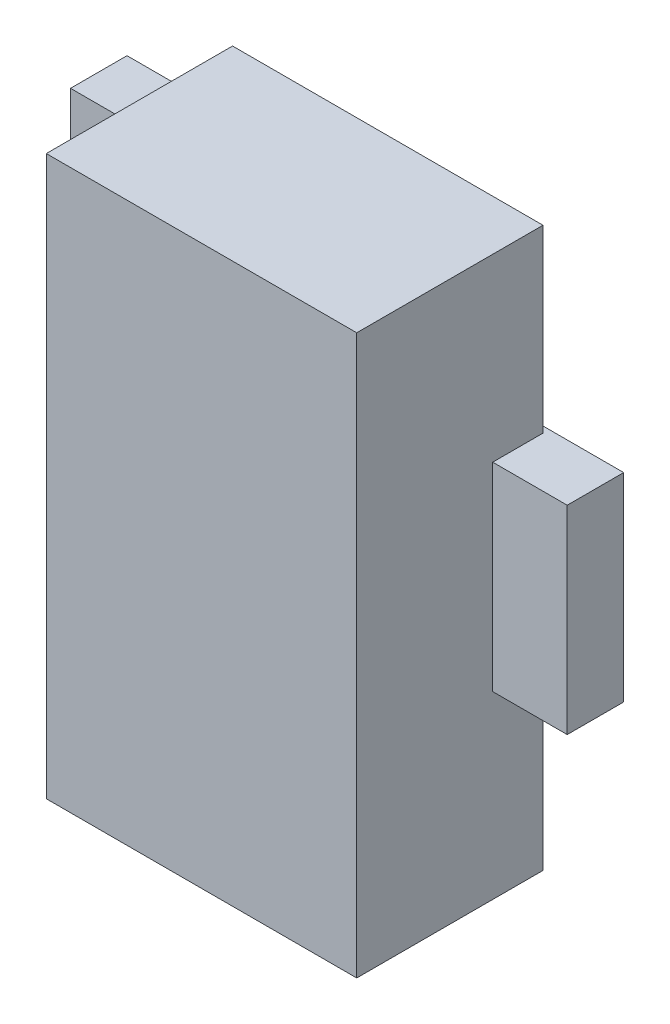
ISO-10303-21;
HEADER;
FILE_DESCRIPTION(('STEP AP214'),'2;1');
FILE_NAME('part.step','',(''),(''),'','','');
FILE_SCHEMA(('AUTOMOTIVE_DESIGN { 1 0 10303 214 1 1 1 1 }'));
ENDSEC;
DATA;
#1=APPLICATION_CONTEXT('core data for automotive mechanical design processes');
#2=APPLICATION_PROTOCOL_DEFINITION('international standard','automotive_design',2000,#1);
#3=PRODUCT_CONTEXT('',#1,'mechanical');
#4=PRODUCT('Part','Part','',(#3));
#5=PRODUCT_RELATED_PRODUCT_CATEGORY('part','',(#4));
#6=PRODUCT_DEFINITION_FORMATION('','',#4);
#7=PRODUCT_DEFINITION_CONTEXT('part definition',#1,'design');
#8=PRODUCT_DEFINITION('design','',#6,#7);
#9=PRODUCT_DEFINITION_SHAPE('','',#8);
#10=(LENGTH_UNIT() NAMED_UNIT(*) SI_UNIT(.MILLI.,.METRE.));
#11=(NAMED_UNIT(*) PLANE_ANGLE_UNIT() SI_UNIT($,.RADIAN.));
#12=(NAMED_UNIT(*) SI_UNIT($,.STERADIAN.) SOLID_ANGLE_UNIT());
#13=UNCERTAINTY_MEASURE_WITH_UNIT(LENGTH_MEASURE(1.E-05),#10,'distance_accuracy_value','');
#14=(GEOMETRIC_REPRESENTATION_CONTEXT(3) GLOBAL_UNCERTAINTY_ASSIGNED_CONTEXT((#13)) GLOBAL_UNIT_ASSIGNED_CONTEXT((#10,
#11,#12)) REPRESENTATION_CONTEXT('',''));
#15=CARTESIAN_POINT('',(0.,0.,0.));
#16=DIRECTION('',(0.,0.,1.));
#17=DIRECTION('',(1.,0.,0.));
#18=AXIS2_PLACEMENT_3D('',#15,#16,#17);
#19=CARTESIAN_POINT('',(-1.2250825886868,-1.70745613098144,0.405));
#20=DIRECTION('',(1.19248806385031E-08,-1.,0.));
#21=DIRECTION('',(0.,0.,1.));
#22=AXIS2_PLACEMENT_3D('',#19,#20,#21);
#23=PLANE('',#22);
#24=DIRECTION('',(0.,0.,-1.));
#25=VECTOR('',#24,1.);
#26=CARTESIAN_POINT('',(-1.2250825886868,-1.70745613098144,0.405));
#27=LINE('',#26,#25);
#28=CARTESIAN_POINT('',(-1.2250825886868,-1.70745613098144,0.405));
#29=VERTEX_POINT('',#28);
#30=CARTESIAN_POINT('',(-1.2250825886868,-1.70745613098144,-0.05));
#31=VERTEX_POINT('',#30);
#32=EDGE_CURVE('P0_E10',#29,#31,#27,.T.);
#33=ORIENTED_EDGE('',*,*,#32,.F.);
#34=DIRECTION('',(-1.,-1.19248806385031E-08,0.));
#35=VECTOR('',#34,1.);
#36=CARTESIAN_POINT('',(-1.2250825886868,-1.70745613098144,0.405));
#37=LINE('',#36,#35);
#38=CARTESIAN_POINT('',(-2.1250825886868,-1.70745614171384,0.405));
#39=VERTEX_POINT('',#38);
#40=EDGE_CURVE('P0_E23',#29,#39,#37,.T.);
#41=ORIENTED_EDGE('',*,*,#40,.T.);
#42=DIRECTION('',(0.,0.,1.));
#43=VECTOR('',#42,1.);
#44=CARTESIAN_POINT('',(-2.1250825886868,-1.70745614171384,0.405));
#45=LINE('',#44,#43);
#46=CARTESIAN_POINT('',(-2.1250825886868,-1.70745614171384,-0.05));
#47=VERTEX_POINT('',#46);
#48=EDGE_CURVE('P0_E59',#47,#39,#45,.T.);
#49=ORIENTED_EDGE('',*,*,#48,.F.);
#50=DIRECTION('',(-1.,-1.19248806385031E-08,0.));
#51=VECTOR('',#50,1.);
#52=CARTESIAN_POINT('',(-1.2250825886868,-1.70745613098144,-0.05));
#53=LINE('',#52,#51);
#54=EDGE_CURVE('P0_E85',#31,#47,#53,.T.);
#55=ORIENTED_EDGE('',*,*,#54,.F.);
#56=EDGE_LOOP('',(#33,#41,#49,#55));
#57=FACE_BOUND('',#56,.T.);
#58=ADVANCED_FACE('P0_F16',(#57),#23,.T.);
#59=CARTESIAN_POINT('',(-1.22508259363563,-1.29245613098144,0.405));
#60=DIRECTION('',(1.,1.19248806385031E-08,0.));
#61=DIRECTION('',(0.,0.,1.));
#62=AXIS2_PLACEMENT_3D('',#59,#60,#61);
#63=PLANE('',#62);
#64=DIRECTION('',(0.,0.,-1.));
#65=VECTOR('',#64,1.);
#66=CARTESIAN_POINT('',(-1.22508259363563,-1.29245613098144,0.405));
#67=LINE('',#66,#65);
#68=CARTESIAN_POINT('',(-1.22508259363563,-1.29245613098144,0.405));
#69=VERTEX_POINT('',#68);
#70=CARTESIAN_POINT('',(-1.22508259363563,-1.29245613098144,-0.05));
#71=VERTEX_POINT('',#70);
#72=EDGE_CURVE('P0_E83',#69,#71,#67,.T.);
#73=ORIENTED_EDGE('',*,*,#72,.F.);
#74=DIRECTION('',(1.19248806385031E-08,-1.,0.));
#75=VECTOR('',#74,1.);
#76=CARTESIAN_POINT('',(-1.22508259363563,-1.29245613098144,0.405));
#77=LINE('',#76,#75);
#78=EDGE_CURVE('P0_E74',#69,#29,#77,.T.);
#79=ORIENTED_EDGE('',*,*,#78,.T.);
#80=ORIENTED_EDGE('',*,*,#32,.T.);
#81=DIRECTION('',(1.19248806385031E-08,-1.,0.));
#82=VECTOR('',#81,1.);
#83=CARTESIAN_POINT('',(-1.22508259363563,-1.29245613098144,-0.05));
#84=LINE('',#83,#82);
#85=EDGE_CURVE('P0_E79',#71,#31,#84,.T.);
#86=ORIENTED_EDGE('',*,*,#85,.F.);
#87=EDGE_LOOP('',(#73,#79,#80,#86));
#88=FACE_BOUND('',#87,.T.);
#89=ADVANCED_FACE('P0_F88',(#88),#63,.T.);
#90=CARTESIAN_POINT('',(-1.22508259363563,-1.29245613098144,-0.05));
#91=DIRECTION('',(0.,0.,-1.));
#92=DIRECTION('',(1.19248806385031E-08,-1.,0.));
#93=AXIS2_PLACEMENT_3D('',#90,#91,#92);
#94=PLANE('',#93);
#95=DIRECTION('',(-1.,-1.19248806385031E-08,0.));
#96=VECTOR('',#95,1.);
#97=CARTESIAN_POINT('',(-2.12508259363563,-1.29245614171384,-0.05));
#98=LINE('',#97,#96);
#99=CARTESIAN_POINT('',(-2.12508259363563,-1.29245614171384,-0.05));
#100=VERTEX_POINT('',#99);
#101=EDGE_CURVE('P0_E69',#71,#100,#98,.T.);
#102=ORIENTED_EDGE('',*,*,#101,.F.);
#103=ORIENTED_EDGE('',*,*,#85,.T.);
#104=ORIENTED_EDGE('',*,*,#54,.T.);
#105=DIRECTION('',(1.19248806385031E-08,-1.,0.));
#106=VECTOR('',#105,1.);
#107=CARTESIAN_POINT('',(-2.1250825886868,-1.70745614171384,-0.05));
#108=LINE('',#107,#106);
#109=EDGE_CURVE('P0_E62',#100,#47,#108,.T.);
#110=ORIENTED_EDGE('',*,*,#109,.F.);
#111=EDGE_LOOP('',(#102,#103,#104,#110));
#112=FACE_BOUND('',#111,.T.);
#113=ADVANCED_FACE('P0_F90',(#112),#94,.T.);
#114=CARTESIAN_POINT('',(-2.1250825886868,-1.70745614171384,0.405));
#115=DIRECTION('',(-1.,-1.19248806385031E-08,0.));
#116=DIRECTION('',(0.,0.,-1.));
#117=AXIS2_PLACEMENT_3D('',#114,#115,#116);
#118=PLANE('',#117);
#119=ORIENTED_EDGE('',*,*,#48,.T.);
#120=DIRECTION('',(-1.19248806385031E-08,1.,0.));
#121=VECTOR('',#120,1.);
#122=CARTESIAN_POINT('',(-2.12508259363563,-1.29245614171384,0.405));
#123=LINE('',#122,#121);
#124=CARTESIAN_POINT('',(-2.12508259363563,-1.29245614171384,0.405));
#125=VERTEX_POINT('',#124);
#126=EDGE_CURVE('P0_E54',#39,#125,#123,.T.);
#127=ORIENTED_EDGE('',*,*,#126,.T.);
#128=DIRECTION('',(0.,0.,1.));
#129=VECTOR('',#128,1.);
#130=CARTESIAN_POINT('',(-2.12508259363563,-1.29245614171384,0.405));
#131=LINE('',#130,#129);
#132=EDGE_CURVE('P0_E58',#100,#125,#131,.T.);
#133=ORIENTED_EDGE('',*,*,#132,.F.);
#134=ORIENTED_EDGE('',*,*,#109,.T.);
#135=EDGE_LOOP('',(#119,#127,#133,#134));
#136=FACE_BOUND('',#135,.T.);
#137=ADVANCED_FACE('P0_F56',(#136),#118,.T.);
#138=CARTESIAN_POINT('',(-1.22508259363563,-1.29245613098144,0.405));
#139=DIRECTION('',(0.,0.,-1.));
#140=DIRECTION('',(1.19248806385031E-08,-1.,0.));
#141=AXIS2_PLACEMENT_3D('',#138,#139,#140);
#142=PLANE('',#141);
#143=ORIENTED_EDGE('',*,*,#126,.F.);
#144=ORIENTED_EDGE('',*,*,#40,.F.);
#145=ORIENTED_EDGE('',*,*,#78,.F.);
#146=DIRECTION('',(1.,1.19248806385031E-08,0.));
#147=VECTOR('',#146,1.);
#148=CARTESIAN_POINT('',(-2.12508259363563,-1.29245614171384,0.405));
#149=LINE('',#148,#147);
#150=EDGE_CURVE('P0_E67',#125,#69,#149,.T.);
#151=ORIENTED_EDGE('',*,*,#150,.F.);
#152=EDGE_LOOP('',(#143,#144,#145,#151));
#153=FACE_BOUND('',#152,.T.);
#154=ADVANCED_FACE('P0_F73',(#153),#142,.F.);
#155=CARTESIAN_POINT('',(-2.12508259363563,-1.29245614171384,0.405));
#156=DIRECTION('',(-1.19248806385031E-08,1.,0.));
#157=DIRECTION('',(0.,0.,-1.));
#158=AXIS2_PLACEMENT_3D('',#155,#156,#157);
#159=PLANE('',#158);
#160=ORIENTED_EDGE('',*,*,#132,.T.);
#161=ORIENTED_EDGE('',*,*,#150,.T.);
#162=ORIENTED_EDGE('',*,*,#72,.T.);
#163=ORIENTED_EDGE('',*,*,#101,.T.);
#164=EDGE_LOOP('',(#160,#161,#162,#163));
#165=FACE_BOUND('',#164,.T.);
#166=ADVANCED_FACE('P0_F66',(#165),#159,.T.);
#167=CLOSED_SHELL('',(#58,#89,#113,#137,#154,#166));
#168=MANIFOLD_SOLID_BREP('P0_B1',#167);
#169=CARTESIAN_POINT('',(-0.192582599508631,-0.799956118669006,0.));
#170=DIRECTION('',(1.19248806385031E-08,-1.,0.));
#171=DIRECTION('',(0.,0.,-1.));
#172=AXIS2_PLACEMENT_3D('',#169,#170,#171);
#173=PLANE('',#172);
#174=DIRECTION('',(1.,1.19248806385031E-08,0.));
#175=VECTOR('',#174,1.);
#176=CARTESIAN_POINT('',(-1.22508259950863,-0.799956130981445,0.405));
#177=LINE('',#176,#175);
#178=CARTESIAN_POINT('',(-0.192582599508631,-0.799956118669006,0.405));
#179=VERTEX_POINT('',#178);
#180=CARTESIAN_POINT('',(1.27491740049137,-0.799956101169244,0.405));
#181=VERTEX_POINT('',#180);
#182=EDGE_CURVE('P1_E11',#179,#181,#177,.T.);
#183=ORIENTED_EDGE('',*,*,#182,.T.);
#184=DIRECTION('',(0.,0.,1.));
#185=VECTOR('',#184,1.);
#186=CARTESIAN_POINT('',(1.27491740049137,-0.799956101169244,0.));
#187=LINE('',#186,#185);
#188=CARTESIAN_POINT('',(1.27491740049137,-0.799956101169244,0.));
#189=VERTEX_POINT('',#188);
#190=EDGE_CURVE('P1_E24',#189,#181,#187,.T.);
#191=ORIENTED_EDGE('',*,*,#190,.F.);
#192=DIRECTION('',(-1.,-1.19248806385031E-08,0.));
#193=VECTOR('',#192,1.);
#194=CARTESIAN_POINT('',(-1.22508259950863,-0.799956130981445,0.));
#195=LINE('',#194,#193);
#196=CARTESIAN_POINT('',(-0.192582599508631,-0.799956118669006,0.));
#197=VERTEX_POINT('',#196);
#198=EDGE_CURVE('P1_E202',#189,#197,#195,.T.);
#199=ORIENTED_EDGE('',*,*,#198,.T.);
#200=DIRECTION('',(0.,0.,1.));
#201=VECTOR('',#200,1.);
#202=CARTESIAN_POINT('',(-0.192582599508631,-0.799956118669006,0.));
#203=LINE('',#202,#201);
#204=EDGE_CURVE('P1_E200',#197,#179,#203,.T.);
#205=ORIENTED_EDGE('',*,*,#204,.T.);
#206=EDGE_LOOP('',(#183,#191,#199,#205));
#207=FACE_BOUND('',#206,.T.);
#208=ADVANCED_FACE('P1_F17',(#207),#173,.F.);
#209=CARTESIAN_POINT('',(-0.760082606276,-0.232456125436376,0.));
#210=DIRECTION('',(-0.707106772754384,-0.707106789618712,0.));
#211=DIRECTION('',(0.707106789618712,-0.707106772754384,0.));
#212=AXIS2_PLACEMENT_3D('',#209,#210,#211);
#213=PLANE('',#212);
#214=DIRECTION('',(0.707106789618711,-0.707106772754383,0.));
#215=VECTOR('',#214,1.);
#216=CARTESIAN_POINT('',(-0.760082606276,-0.232456125436376,0.405));
#217=LINE('',#216,#215);
#218=CARTESIAN_POINT('',(-0.760082606276,-0.232456125436376,0.405));
#219=VERTEX_POINT('',#218);
#220=EDGE_CURVE('P1_E198',#219,#179,#217,.T.);
#221=ORIENTED_EDGE('',*,*,#220,.T.);
#222=ORIENTED_EDGE('',*,*,#204,.F.);
#223=DIRECTION('',(-0.707106789618711,0.707106772754383,0.));
#224=VECTOR('',#223,1.);
#225=CARTESIAN_POINT('',(-0.192582599508631,-0.799956118669006,0.));
#226=LINE('',#225,#224);
#227=CARTESIAN_POINT('',(-0.760082606276,-0.232456125436376,0.));
#228=VERTEX_POINT('',#227);
#229=EDGE_CURVE('P1_E195',#197,#228,#226,.T.);
#230=ORIENTED_EDGE('',*,*,#229,.T.);
#231=DIRECTION('',(0.,0.,1.));
#232=VECTOR('',#231,1.);
#233=CARTESIAN_POINT('',(-0.760082606276,-0.232456125436376,0.));
#234=LINE('',#233,#232);
#235=EDGE_CURVE('P1_E192',#228,#219,#234,.T.);
#236=ORIENTED_EDGE('',*,*,#235,.T.);
#237=EDGE_LOOP('',(#221,#222,#230,#236));
#238=FACE_BOUND('',#237,.T.);
#239=ADVANCED_FACE('P1_F243',(#238),#213,.F.);
#240=CARTESIAN_POINT('',(1.27491738141156,0.800043898830756,0.));
#241=DIRECTION('',(-1.19248806385031E-08,1.,0.));
#242=DIRECTION('',(0.,0.,1.));
#243=AXIS2_PLACEMENT_3D('',#240,#241,#242);
#244=PLANE('',#243);
#245=DIRECTION('',(-1.,-1.19248806385031E-08,0.));
#246=VECTOR('',#245,1.);
#247=CARTESIAN_POINT('',(-1.22508261858844,0.800043869018555,0.405));
#248=LINE('',#247,#246);
#249=CARTESIAN_POINT('',(1.27491738141156,0.800043898830756,0.405));
#250=VERTEX_POINT('',#249);
#251=CARTESIAN_POINT('',(-0.19258261858844,0.800043881330994,0.405));
#252=VERTEX_POINT('',#251);
#253=EDGE_CURVE('P1_E189',#250,#252,#248,.T.);
#254=ORIENTED_EDGE('',*,*,#253,.T.);
#255=DIRECTION('',(0.,0.,-1.));
#256=VECTOR('',#255,1.);
#257=CARTESIAN_POINT('',(-0.19258261858844,0.800043881330994,0.));
#258=LINE('',#257,#256);
#259=CARTESIAN_POINT('',(-0.19258261858844,0.800043881330994,0.));
#260=VERTEX_POINT('',#259);
#261=EDGE_CURVE('P1_E186',#252,#260,#258,.T.);
#262=ORIENTED_EDGE('',*,*,#261,.T.);
#263=DIRECTION('',(1.,1.19248806385031E-08,0.));
#264=VECTOR('',#263,1.);
#265=CARTESIAN_POINT('',(-1.22508261858844,0.800043869018555,0.));
#266=LINE('',#265,#264);
#267=CARTESIAN_POINT('',(1.27491738141156,0.800043898830756,0.));
#268=VERTEX_POINT('',#267);
#269=EDGE_CURVE('P1_E184',#260,#268,#266,.T.);
#270=ORIENTED_EDGE('',*,*,#269,.T.);
#271=DIRECTION('',(0.,0.,-1.));
#272=VECTOR('',#271,1.);
#273=CARTESIAN_POINT('',(1.27491738141156,0.800043898830756,0.));
#274=LINE('',#273,#272);
#275=EDGE_CURVE('P1_E181',#250,#268,#274,.T.);
#276=ORIENTED_EDGE('',*,*,#275,.F.);
#277=EDGE_LOOP('',(#254,#262,#270,#276));
#278=FACE_BOUND('',#277,.T.);
#279=ADVANCED_FACE('P1_F210',(#278),#244,.F.);
#280=CARTESIAN_POINT('',(-0.19258261858844,0.800043881330994,0.));
#281=DIRECTION('',(-0.707106789618712,0.707106772754384,0.));
#282=DIRECTION('',(-0.707106772754384,-0.707106789618712,0.));
#283=AXIS2_PLACEMENT_3D('',#280,#281,#282);
#284=PLANE('',#283);
#285=DIRECTION('',(-0.707106772754383,-0.707106789618712,0.));
#286=VECTOR('',#285,1.);
#287=CARTESIAN_POINT('',(-0.19258261858844,0.800043881330994,0.405));
#288=LINE('',#287,#286);
#289=CARTESIAN_POINT('',(-0.76008261182107,0.232543874563624,0.405));
#290=VERTEX_POINT('',#289);
#291=EDGE_CURVE('P1_E179',#252,#290,#288,.T.);
#292=ORIENTED_EDGE('',*,*,#291,.T.);
#293=DIRECTION('',(0.,0.,-1.));
#294=VECTOR('',#293,1.);
#295=CARTESIAN_POINT('',(-0.76008261182107,0.232543874563624,0.));
#296=LINE('',#295,#294);
#297=CARTESIAN_POINT('',(-0.76008261182107,0.232543874563624,0.));
#298=VERTEX_POINT('',#297);
#299=EDGE_CURVE('P1_E177',#290,#298,#296,.T.);
#300=ORIENTED_EDGE('',*,*,#299,.T.);
#301=DIRECTION('',(0.707106772754383,0.707106789618712,0.));
#302=VECTOR('',#301,1.);
#303=CARTESIAN_POINT('',(-0.76008261182107,0.232543874563624,0.));
#304=LINE('',#303,#302);
#305=EDGE_CURVE('P1_E174',#298,#260,#304,.T.);
#306=ORIENTED_EDGE('',*,*,#305,.T.);
#307=ORIENTED_EDGE('',*,*,#261,.F.);
#308=EDGE_LOOP('',(#292,#300,#306,#307));
#309=FACE_BOUND('',#308,.T.);
#310=ADVANCED_FACE('P1_F212',(#309),#284,.F.);
#311=CARTESIAN_POINT('',(-1.22508263587952,2.25004386901856,0.405));
#312=DIRECTION('',(0.,0.,1.));
#313=DIRECTION('',(1.19248806385031E-08,-1.,0.));
#314=AXIS2_PLACEMENT_3D('',#311,#312,#313);
#315=PLANE('',#314);
#316=ORIENTED_EDGE('',*,*,#291,.F.);
#317=ORIENTED_EDGE('',*,*,#253,.F.);
#318=DIRECTION('',(-1.19248806385031E-08,1.,0.));
#319=VECTOR('',#318,1.);
#320=CARTESIAN_POINT('',(1.27491741778245,-2.24995610116924,0.405));
#321=LINE('',#320,#319);
#322=EDGE_CURVE('P1_E171',#181,#250,#321,.T.);
#323=ORIENTED_EDGE('',*,*,#322,.F.);
#324=ORIENTED_EDGE('',*,*,#182,.F.);
#325=ORIENTED_EDGE('',*,*,#220,.F.);
#326=DIRECTION('',(-1.,-1.19248806385031E-08,0.));
#327=VECTOR('',#326,1.);
#328=CARTESIAN_POINT('',(-1.225082606276,-0.232456130981445,0.405));
#329=LINE('',#328,#327);
#330=CARTESIAN_POINT('',(-1.225082606276,-0.232456130981445,0.405));
#331=VERTEX_POINT('',#330);
#332=EDGE_CURVE('P1_E168',#219,#331,#329,.T.);
#333=ORIENTED_EDGE('',*,*,#332,.T.);
#334=DIRECTION('',(1.19248806385031E-08,-1.,0.));
#335=VECTOR('',#334,1.);
#336=CARTESIAN_POINT('',(-1.22508263587952,2.25004386901856,0.405));
#337=LINE('',#336,#335);
#338=CARTESIAN_POINT('',(-1.22508261182107,0.232543869018555,0.405));
#339=VERTEX_POINT('',#338);
#340=EDGE_CURVE('P1_E165',#339,#331,#337,.T.);
#341=ORIENTED_EDGE('',*,*,#340,.F.);
#342=DIRECTION('',(1.,1.19248806385031E-08,0.));
#343=VECTOR('',#342,1.);
#344=CARTESIAN_POINT('',(-0.76008261182107,0.232543874563624,0.405));
#345=LINE('',#344,#343);
#346=EDGE_CURVE('P1_E162',#339,#290,#345,.T.);
#347=ORIENTED_EDGE('',*,*,#346,.T.);
#348=EDGE_LOOP('',(#316,#317,#323,#324,#325,#333,#341,#347));
#349=FACE_BOUND('',#348,.T.);
#350=ADVANCED_FACE('P1_F207',(#349),#315,.F.);
#351=CARTESIAN_POINT('',(-1.225082606276,-0.232456130981445,0.));
#352=DIRECTION('',(1.19248806385031E-08,-1.,0.));
#353=DIRECTION('',(0.,0.,-1.));
#354=AXIS2_PLACEMENT_3D('',#351,#352,#353);
#355=PLANE('',#354);
#356=ORIENTED_EDGE('',*,*,#332,.F.);
#357=ORIENTED_EDGE('',*,*,#235,.F.);
#358=DIRECTION('',(-1.,-1.19248806385031E-08,0.));
#359=VECTOR('',#358,1.);
#360=CARTESIAN_POINT('',(-1.225082606276,-0.232456130981445,0.));
#361=LINE('',#360,#359);
#362=CARTESIAN_POINT('',(-1.225082606276,-0.232456130981445,0.));
#363=VERTEX_POINT('',#362);
#364=EDGE_CURVE('P1_E160',#228,#363,#361,.T.);
#365=ORIENTED_EDGE('',*,*,#364,.T.);
#366=DIRECTION('',(0.,0.,-1.));
#367=VECTOR('',#366,1.);
#368=CARTESIAN_POINT('',(-1.225082606276,-0.232456130981445,0.));
#369=LINE('',#368,#367);
#370=EDGE_CURVE('P1_E157',#331,#363,#369,.T.);
#371=ORIENTED_EDGE('',*,*,#370,.F.);
#372=EDGE_LOOP('',(#356,#357,#365,#371));
#373=FACE_BOUND('',#372,.T.);
#374=ADVANCED_FACE('P1_F226',(#373),#355,.F.);
#375=CARTESIAN_POINT('',(-1.22508263587952,2.25004386901856,0.));
#376=DIRECTION('',(0.,0.,1.));
#377=DIRECTION('',(1.19248806385031E-08,-1.,0.));
#378=AXIS2_PLACEMENT_3D('',#375,#376,#377);
#379=PLANE('',#378);
#380=ORIENTED_EDGE('',*,*,#198,.F.);
#381=DIRECTION('',(-1.19248806385031E-08,1.,0.));
#382=VECTOR('',#381,1.);
#383=CARTESIAN_POINT('',(1.27491741778245,-2.24995610116924,0.));
#384=LINE('',#383,#382);
#385=CARTESIAN_POINT('',(1.27491741778245,-2.24995610116924,0.));
#386=VERTEX_POINT('',#385);
#387=EDGE_CURVE('P1_E154',#386,#189,#384,.T.);
#388=ORIENTED_EDGE('',*,*,#387,.F.);
#389=DIRECTION('',(1.,1.19248806385031E-08,0.));
#390=VECTOR('',#389,1.);
#391=CARTESIAN_POINT('',(-1.22508258221755,-2.24995613098145,0.));
#392=LINE('',#391,#390);
#393=CARTESIAN_POINT('',(-1.22508258221755,-2.24995613098145,0.));
#394=VERTEX_POINT('',#393);
#395=EDGE_CURVE('P1_E151',#394,#386,#392,.T.);
#396=ORIENTED_EDGE('',*,*,#395,.F.);
#397=DIRECTION('',(1.19248806385031E-08,-1.,0.));
#398=VECTOR('',#397,1.);
#399=CARTESIAN_POINT('',(-1.22508263587952,2.25004386901856,0.));
#400=LINE('',#399,#398);
#401=EDGE_CURVE('P1_E149',#363,#394,#400,.T.);
#402=ORIENTED_EDGE('',*,*,#401,.F.);
#403=ORIENTED_EDGE('',*,*,#364,.F.);
#404=ORIENTED_EDGE('',*,*,#229,.F.);
#405=EDGE_LOOP('',(#380,#388,#396,#402,#403,#404));
#406=FACE_BOUND('',#405,.T.);
#407=ADVANCED_FACE('P1_F229',(#406),#379,.F.);
#408=CARTESIAN_POINT('',(-1.22508263587952,2.25004386901856,0.));
#409=DIRECTION('',(0.,0.,1.));
#410=DIRECTION('',(1.19248806385031E-08,-1.,0.));
#411=AXIS2_PLACEMENT_3D('',#408,#409,#410);
#412=PLANE('',#411);
#413=DIRECTION('',(-1.,-1.19248806385031E-08,0.));
#414=VECTOR('',#413,1.);
#415=CARTESIAN_POINT('',(-0.76008261182107,0.232543874563624,0.));
#416=LINE('',#415,#414);
#417=CARTESIAN_POINT('',(-1.22508261182107,0.232543869018555,0.));
#418=VERTEX_POINT('',#417);
#419=EDGE_CURVE('P1_E146',#298,#418,#416,.T.);
#420=ORIENTED_EDGE('',*,*,#419,.T.);
#421=DIRECTION('',(1.19248806385031E-08,-1.,0.));
#422=VECTOR('',#421,1.);
#423=CARTESIAN_POINT('',(-1.22508263587952,2.25004386901856,0.));
#424=LINE('',#423,#422);
#425=CARTESIAN_POINT('',(-1.22508263587952,2.25004386901856,0.));
#426=VERTEX_POINT('',#425);
#427=EDGE_CURVE('P1_E144',#426,#418,#424,.T.);
#428=ORIENTED_EDGE('',*,*,#427,.F.);
#429=DIRECTION('',(-1.,-1.19248806385031E-08,0.));
#430=VECTOR('',#429,1.);
#431=CARTESIAN_POINT('',(1.27491736412048,2.25004389883076,0.));
#432=LINE('',#431,#430);
#433=CARTESIAN_POINT('',(1.27491736412048,2.25004389883076,0.));
#434=VERTEX_POINT('',#433);
#435=EDGE_CURVE('P1_E108',#434,#426,#432,.T.);
#436=ORIENTED_EDGE('',*,*,#435,.F.);
#437=DIRECTION('',(-1.19248806385031E-08,1.,0.));
#438=VECTOR('',#437,1.);
#439=CARTESIAN_POINT('',(1.27491741778245,-2.24995610116924,0.));
#440=LINE('',#439,#438);
#441=EDGE_CURVE('P1_E140',#268,#434,#440,.T.);
#442=ORIENTED_EDGE('',*,*,#441,.F.);
#443=ORIENTED_EDGE('',*,*,#269,.F.);
#444=ORIENTED_EDGE('',*,*,#305,.F.);
#445=EDGE_LOOP('',(#420,#428,#436,#442,#443,#444));
#446=FACE_BOUND('',#445,.T.);
#447=ADVANCED_FACE('P1_F217',(#446),#412,.F.);
#448=CARTESIAN_POINT('',(-0.76008261182107,0.232543874563624,0.));
#449=DIRECTION('',(-1.19248806385031E-08,1.,0.));
#450=DIRECTION('',(0.,0.,1.));
#451=AXIS2_PLACEMENT_3D('',#448,#449,#450);
#452=PLANE('',#451);
#453=ORIENTED_EDGE('',*,*,#346,.F.);
#454=DIRECTION('',(0.,0.,1.));
#455=VECTOR('',#454,1.);
#456=CARTESIAN_POINT('',(-1.22508261182107,0.232543869018555,0.));
#457=LINE('',#456,#455);
#458=EDGE_CURVE('P1_E138',#418,#339,#457,.T.);
#459=ORIENTED_EDGE('',*,*,#458,.F.);
#460=ORIENTED_EDGE('',*,*,#419,.F.);
#461=ORIENTED_EDGE('',*,*,#299,.F.);
#462=EDGE_LOOP('',(#453,#459,#460,#461));
#463=FACE_BOUND('',#462,.T.);
#464=ADVANCED_FACE('P1_F221',(#463),#452,.F.);
#465=CARTESIAN_POINT('',(-1.22508258221755,-2.24995613098145,0.));
#466=DIRECTION('',(1.19248806385031E-08,-1.,0.));
#467=DIRECTION('',(0.,0.,-1.));
#468=AXIS2_PLACEMENT_3D('',#465,#466,#467);
#469=PLANE('',#468);
#470=DIRECTION('',(0.,0.,1.));
#471=VECTOR('',#470,1.);
#472=CARTESIAN_POINT('',(-1.22508258221755,-2.24995613098145,0.));
#473=LINE('',#472,#471);
#474=CARTESIAN_POINT('',(-1.22508258221755,-2.24995613098145,1.5));
#475=VERTEX_POINT('',#474);
#476=EDGE_CURVE('P1_E125',#394,#475,#473,.T.);
#477=ORIENTED_EDGE('',*,*,#476,.F.);
#478=ORIENTED_EDGE('',*,*,#395,.T.);
#479=DIRECTION('',(0.,0.,-1.));
#480=VECTOR('',#479,1.);
#481=CARTESIAN_POINT('',(1.27491741778245,-2.24995610116924,0.));
#482=LINE('',#481,#480);
#483=CARTESIAN_POINT('',(1.27491741778245,-2.24995610116924,1.5));
#484=VERTEX_POINT('',#483);
#485=EDGE_CURVE('P1_E134',#484,#386,#482,.T.);
#486=ORIENTED_EDGE('',*,*,#485,.F.);
#487=DIRECTION('',(1.,1.19248806385031E-08,0.));
#488=VECTOR('',#487,1.);
#489=CARTESIAN_POINT('',(-1.22508258221755,-2.24995613098145,1.5));
#490=LINE('',#489,#488);
#491=EDGE_CURVE('P1_E132',#475,#484,#490,.T.);
#492=ORIENTED_EDGE('',*,*,#491,.F.);
#493=EDGE_LOOP('',(#477,#478,#486,#492));
#494=FACE_BOUND('',#493,.T.);
#495=ADVANCED_FACE('P1_F232',(#494),#469,.T.);
#496=CARTESIAN_POINT('',(1.27491741778245,-2.24995610116925,0.));
#497=DIRECTION('',(1.,1.19248806385031E-08,0.));
#498=DIRECTION('',(0.,0.,1.));
#499=AXIS2_PLACEMENT_3D('',#496,#497,#498);
#500=PLANE('',#499);
#501=ORIENTED_EDGE('',*,*,#190,.T.);
#502=ORIENTED_EDGE('',*,*,#322,.T.);
#503=ORIENTED_EDGE('',*,*,#275,.T.);
#504=ORIENTED_EDGE('',*,*,#441,.T.);
#505=DIRECTION('',(0.,0.,-1.));
#506=VECTOR('',#505,1.);
#507=CARTESIAN_POINT('',(1.27491736412048,2.25004389883076,0.));
#508=LINE('',#507,#506);
#509=CARTESIAN_POINT('',(1.27491736412048,2.25004389883076,1.5));
#510=VERTEX_POINT('',#509);
#511=EDGE_CURVE('P1_E130',#510,#434,#508,.T.);
#512=ORIENTED_EDGE('',*,*,#511,.F.);
#513=DIRECTION('',(-1.19248806385031E-08,1.,0.));
#514=VECTOR('',#513,1.);
#515=CARTESIAN_POINT('',(1.27491736412048,2.25004389883076,1.5));
#516=LINE('',#515,#514);
#517=EDGE_CURVE('P1_E112',#484,#510,#516,.T.);
#518=ORIENTED_EDGE('',*,*,#517,.F.);
#519=ORIENTED_EDGE('',*,*,#485,.T.);
#520=ORIENTED_EDGE('',*,*,#387,.T.);
#521=EDGE_LOOP('',(#501,#502,#503,#504,#512,#518,#519,#520));
#522=FACE_BOUND('',#521,.T.);
#523=ADVANCED_FACE('P1_F204',(#522),#500,.T.);
#524=CARTESIAN_POINT('',(1.27491736412048,2.25004389883076,0.));
#525=DIRECTION('',(-1.19248806385031E-08,1.,0.));
#526=DIRECTION('',(0.,0.,1.));
#527=AXIS2_PLACEMENT_3D('',#524,#525,#526);
#528=PLANE('',#527);
#529=ORIENTED_EDGE('',*,*,#511,.T.);
#530=ORIENTED_EDGE('',*,*,#435,.T.);
#531=DIRECTION('',(0.,0.,-1.));
#532=VECTOR('',#531,1.);
#533=CARTESIAN_POINT('',(-1.22508263587952,2.25004386901856,0.));
#534=LINE('',#533,#532);
#535=CARTESIAN_POINT('',(-1.22508263587952,2.25004386901856,1.5));
#536=VERTEX_POINT('',#535);
#537=EDGE_CURVE('P1_E103',#536,#426,#534,.T.);
#538=ORIENTED_EDGE('',*,*,#537,.F.);
#539=DIRECTION('',(-1.,-1.19248806385031E-08,0.));
#540=VECTOR('',#539,1.);
#541=CARTESIAN_POINT('',(-1.22508263587952,2.25004386901856,1.5));
#542=LINE('',#541,#540);
#543=EDGE_CURVE('P1_E106',#510,#536,#542,.T.);
#544=ORIENTED_EDGE('',*,*,#543,.F.);
#545=EDGE_LOOP('',(#529,#530,#538,#544));
#546=FACE_BOUND('',#545,.T.);
#547=ADVANCED_FACE('P1_F105',(#546),#528,.T.);
#548=CARTESIAN_POINT('',(-1.22508263587952,2.25004386901856,0.));
#549=DIRECTION('',(-1.,-1.19248806385031E-08,0.));
#550=DIRECTION('',(0.,0.,-1.));
#551=AXIS2_PLACEMENT_3D('',#548,#549,#550);
#552=PLANE('',#551);
#553=ORIENTED_EDGE('',*,*,#458,.T.);
#554=ORIENTED_EDGE('',*,*,#340,.T.);
#555=ORIENTED_EDGE('',*,*,#370,.T.);
#556=ORIENTED_EDGE('',*,*,#401,.T.);
#557=ORIENTED_EDGE('',*,*,#476,.T.);
#558=DIRECTION('',(1.19248806385031E-08,-1.,0.));
#559=VECTOR('',#558,1.);
#560=CARTESIAN_POINT('',(-1.22508263587952,2.25004386901856,1.5));
#561=LINE('',#560,#559);
#562=EDGE_CURVE('P1_E119',#536,#475,#561,.T.);
#563=ORIENTED_EDGE('',*,*,#562,.F.);
#564=ORIENTED_EDGE('',*,*,#537,.T.);
#565=ORIENTED_EDGE('',*,*,#427,.T.);
#566=EDGE_LOOP('',(#553,#554,#555,#556,#557,#563,#564,#565));
#567=FACE_BOUND('',#566,.T.);
#568=ADVANCED_FACE('P1_F122',(#567),#552,.T.);
#569=CARTESIAN_POINT('',(-1.22508263587952,2.25004386901856,1.5));
#570=DIRECTION('',(0.,0.,1.));
#571=DIRECTION('',(1.19248806385031E-08,-1.,0.));
#572=AXIS2_PLACEMENT_3D('',#569,#570,#571);
#573=PLANE('',#572);
#574=ORIENTED_EDGE('',*,*,#543,.T.);
#575=ORIENTED_EDGE('',*,*,#562,.T.);
#576=ORIENTED_EDGE('',*,*,#491,.T.);
#577=ORIENTED_EDGE('',*,*,#517,.T.);
#578=EDGE_LOOP('',(#574,#575,#576,#577));
#579=FACE_BOUND('',#578,.T.);
#580=ADVANCED_FACE('P1_F117',(#579),#573,.T.);
#581=CLOSED_SHELL('',(#208,#239,#279,#310,#350,#374,#407,#447,#464,#495,#523,#547,#568,#580));
#582=MANIFOLD_SOLID_BREP('P1_B1',#581);
#583=CARTESIAN_POINT('',(-1.22508262446144,1.29254386901855,0.405));
#584=DIRECTION('',(1.19248806385031E-08,-1.,0.));
#585=DIRECTION('',(0.,0.,1.));
#586=AXIS2_PLACEMENT_3D('',#583,#584,#585);
#587=PLANE('',#586);
#588=DIRECTION('',(0.,0.,-1.));
#589=VECTOR('',#588,1.);
#590=CARTESIAN_POINT('',(-1.22508262446144,1.29254386901855,0.405));
#591=LINE('',#590,#589);
#592=CARTESIAN_POINT('',(-1.22508262446144,1.29254386901855,0.405));
#593=VERTEX_POINT('',#592);
#594=CARTESIAN_POINT('',(-1.22508262446144,1.29254386901855,-0.05));
#595=VERTEX_POINT('',#594);
#596=EDGE_CURVE('P2_E11',#593,#595,#591,.T.);
#597=ORIENTED_EDGE('',*,*,#596,.F.);
#598=DIRECTION('',(-1.,-1.19248806385031E-08,0.));
#599=VECTOR('',#598,1.);
#600=CARTESIAN_POINT('',(-1.22508262446144,1.29254386901855,0.405));
#601=LINE('',#600,#599);
#602=CARTESIAN_POINT('',(-2.12508262446144,1.29254385828616,0.405));
#603=VERTEX_POINT('',#602);
#604=EDGE_CURVE('P2_E24',#593,#603,#601,.T.);
#605=ORIENTED_EDGE('',*,*,#604,.T.);
#606=DIRECTION('',(0.,0.,1.));
#607=VECTOR('',#606,1.);
#608=CARTESIAN_POINT('',(-2.12508262446144,1.29254385828616,0.405));
#609=LINE('',#608,#607);
#610=CARTESIAN_POINT('',(-2.12508262446144,1.29254385828616,-0.05));
#611=VERTEX_POINT('',#610);
#612=EDGE_CURVE('P2_E60',#611,#603,#609,.T.);
#613=ORIENTED_EDGE('',*,*,#612,.F.);
#614=DIRECTION('',(-1.,-1.19248806385031E-08,0.));
#615=VECTOR('',#614,1.);
#616=CARTESIAN_POINT('',(-1.22508262446144,1.29254386901855,-0.05));
#617=LINE('',#616,#615);
#618=EDGE_CURVE('P2_E86',#595,#611,#617,.T.);
#619=ORIENTED_EDGE('',*,*,#618,.F.);
#620=EDGE_LOOP('',(#597,#605,#613,#619));
#621=FACE_BOUND('',#620,.T.);
#622=ADVANCED_FACE('P2_F17',(#621),#587,.T.);
#623=CARTESIAN_POINT('',(-1.22508262941027,1.70754386901855,0.405));
#624=DIRECTION('',(1.,1.19248806385031E-08,0.));
#625=DIRECTION('',(0.,0.,1.));
#626=AXIS2_PLACEMENT_3D('',#623,#624,#625);
#627=PLANE('',#626);
#628=DIRECTION('',(0.,0.,-1.));
#629=VECTOR('',#628,1.);
#630=CARTESIAN_POINT('',(-1.22508262941027,1.70754386901855,0.405));
#631=LINE('',#630,#629);
#632=CARTESIAN_POINT('',(-1.22508262941027,1.70754386901855,0.405));
#633=VERTEX_POINT('',#632);
#634=CARTESIAN_POINT('',(-1.22508262941027,1.70754386901855,-0.05));
#635=VERTEX_POINT('',#634);
#636=EDGE_CURVE('P2_E84',#633,#635,#631,.T.);
#637=ORIENTED_EDGE('',*,*,#636,.F.);
#638=DIRECTION('',(1.19248806385031E-08,-1.,0.));
#639=VECTOR('',#638,1.);
#640=CARTESIAN_POINT('',(-1.22508262941027,1.70754386901855,0.405));
#641=LINE('',#640,#639);
#642=EDGE_CURVE('P2_E76',#633,#593,#641,.T.);
#643=ORIENTED_EDGE('',*,*,#642,.T.);
#644=ORIENTED_EDGE('',*,*,#596,.T.);
#645=DIRECTION('',(1.19248806385031E-08,-1.,0.));
#646=VECTOR('',#645,1.);
#647=CARTESIAN_POINT('',(-1.22508262941027,1.70754386901855,-0.05));
#648=LINE('',#647,#646);
#649=EDGE_CURVE('P2_E81',#635,#595,#648,.T.);
#650=ORIENTED_EDGE('',*,*,#649,.F.);
#651=EDGE_LOOP('',(#637,#643,#644,#650));
#652=FACE_BOUND('',#651,.T.);
#653=ADVANCED_FACE('P2_F89',(#652),#627,.T.);
#654=CARTESIAN_POINT('',(-1.22508262941027,1.70754386901855,-0.05));
#655=DIRECTION('',(0.,0.,-1.));
#656=DIRECTION('',(1.19248806385031E-08,-1.,0.));
#657=AXIS2_PLACEMENT_3D('',#654,#655,#656);
#658=PLANE('',#657);
#659=DIRECTION('',(-1.,-1.19248806385031E-08,0.));
#660=VECTOR('',#659,1.);
#661=CARTESIAN_POINT('',(-2.12508262941027,1.70754385828616,-0.05));
#662=LINE('',#661,#660);
#663=CARTESIAN_POINT('',(-2.12508262941027,1.70754385828616,-0.05));
#664=VERTEX_POINT('',#663);
#665=EDGE_CURVE('P2_E71',#635,#664,#662,.T.);
#666=ORIENTED_EDGE('',*,*,#665,.F.);
#667=ORIENTED_EDGE('',*,*,#649,.T.);
#668=ORIENTED_EDGE('',*,*,#618,.T.);
#669=DIRECTION('',(1.19248806385031E-08,-1.,0.));
#670=VECTOR('',#669,1.);
#671=CARTESIAN_POINT('',(-2.12508262446144,1.29254385828616,-0.05));
#672=LINE('',#671,#670);
#673=EDGE_CURVE('P2_E63',#664,#611,#672,.T.);
#674=ORIENTED_EDGE('',*,*,#673,.F.);
#675=EDGE_LOOP('',(#666,#667,#668,#674));
#676=FACE_BOUND('',#675,.T.);
#677=ADVANCED_FACE('P2_F91',(#676),#658,.T.);
#678=CARTESIAN_POINT('',(-2.12508262446144,1.29254385828616,0.405));
#679=DIRECTION('',(-1.,-1.19248806385031E-08,0.));
#680=DIRECTION('',(0.,0.,-1.));
#681=AXIS2_PLACEMENT_3D('',#678,#679,#680);
#682=PLANE('',#681);
#683=ORIENTED_EDGE('',*,*,#612,.T.);
#684=DIRECTION('',(-1.19248806385031E-08,1.,0.));
#685=VECTOR('',#684,1.);
#686=CARTESIAN_POINT('',(-2.12508262941027,1.70754385828616,0.405));
#687=LINE('',#686,#685);
#688=CARTESIAN_POINT('',(-2.12508262941027,1.70754385828616,0.405));
#689=VERTEX_POINT('',#688);
#690=EDGE_CURVE('P2_E55',#603,#689,#687,.T.);
#691=ORIENTED_EDGE('',*,*,#690,.T.);
#692=DIRECTION('',(0.,0.,1.));
#693=VECTOR('',#692,1.);
#694=CARTESIAN_POINT('',(-2.12508262941027,1.70754385828616,0.405));
#695=LINE('',#694,#693);
#696=EDGE_CURVE('P2_E59',#664,#689,#695,.T.);
#697=ORIENTED_EDGE('',*,*,#696,.F.);
#698=ORIENTED_EDGE('',*,*,#673,.T.);
#699=EDGE_LOOP('',(#683,#691,#697,#698));
#700=FACE_BOUND('',#699,.T.);
#701=ADVANCED_FACE('P2_F57',(#700),#682,.T.);
#702=CARTESIAN_POINT('',(-1.22508262941027,1.70754386901855,0.405));
#703=DIRECTION('',(0.,0.,-1.));
#704=DIRECTION('',(1.19248806385031E-08,-1.,0.));
#705=AXIS2_PLACEMENT_3D('',#702,#703,#704);
#706=PLANE('',#705);
#707=ORIENTED_EDGE('',*,*,#690,.F.);
#708=ORIENTED_EDGE('',*,*,#604,.F.);
#709=ORIENTED_EDGE('',*,*,#642,.F.);
#710=DIRECTION('',(1.,1.19248806385031E-08,0.));
#711=VECTOR('',#710,1.);
#712=CARTESIAN_POINT('',(-2.12508262941027,1.70754385828616,0.405));
#713=LINE('',#712,#711);
#714=EDGE_CURVE('P2_E69',#689,#633,#713,.T.);
#715=ORIENTED_EDGE('',*,*,#714,.F.);
#716=EDGE_LOOP('',(#707,#708,#709,#715));
#717=FACE_BOUND('',#716,.T.);
#718=ADVANCED_FACE('P2_F75',(#717),#706,.F.);
#719=CARTESIAN_POINT('',(-2.12508262941027,1.70754385828616,0.405));
#720=DIRECTION('',(-1.19248806385031E-08,1.,0.));
#721=DIRECTION('',(0.,0.,-1.));
#722=AXIS2_PLACEMENT_3D('',#719,#720,#721);
#723=PLANE('',#722);
#724=ORIENTED_EDGE('',*,*,#696,.T.);
#725=ORIENTED_EDGE('',*,*,#714,.T.);
#726=ORIENTED_EDGE('',*,*,#636,.T.);
#727=ORIENTED_EDGE('',*,*,#665,.T.);
#728=EDGE_LOOP('',(#724,#725,#726,#727));
#729=FACE_BOUND('',#728,.T.);
#730=ADVANCED_FACE('P2_F67',(#729),#723,.T.);
#731=CLOSED_SHELL('',(#622,#653,#677,#701,#718,#730));
#732=MANIFOLD_SOLID_BREP('P2_B1',#731);
#733=CARTESIAN_POINT('',(-2.12508259950863,-0.799956141713838,-0.05));
#734=DIRECTION('',(0.,0.,-1.));
#735=DIRECTION('',(-1.19248806385031E-08,1.,0.));
#736=AXIS2_PLACEMENT_3D('',#733,#734,#735);
#737=PLANE('',#736);
#738=DIRECTION('',(-1.,-1.19248806385031E-08,0.));
#739=VECTOR('',#738,1.);
#740=CARTESIAN_POINT('',(-0.19258261858844,0.800043881330994,-0.05));
#741=LINE('',#740,#739);
#742=CARTESIAN_POINT('',(1.87491738141156,0.800043905985685,-0.05));
#743=VERTEX_POINT('',#742);
#744=CARTESIAN_POINT('',(-0.19258261858844,0.800043881330994,-0.05));
#745=VERTEX_POINT('',#744);
#746=EDGE_CURVE('P3_E10',#743,#745,#741,.T.);
#747=ORIENTED_EDGE('',*,*,#746,.F.);
#748=DIRECTION('',(-1.19248806385031E-08,1.,0.));
#749=VECTOR('',#748,1.);
#750=CARTESIAN_POINT('',(1.87491738141156,0.800043905985685,-0.05));
#751=LINE('',#750,#749);
#752=CARTESIAN_POINT('',(1.87491740049137,-0.799956094014315,-0.05));
#753=VERTEX_POINT('',#752);
#754=EDGE_CURVE('P3_E23',#753,#743,#751,.T.);
#755=ORIENTED_EDGE('',*,*,#754,.F.);
#756=DIRECTION('',(1.,1.19248806385031E-08,0.));
#757=VECTOR('',#756,1.);
#758=CARTESIAN_POINT('',(1.87491740049137,-0.799956094014315,-0.05));
#759=LINE('',#758,#757);
#760=CARTESIAN_POINT('',(-0.19258259950863,-0.799956118669006,-0.05));
#761=VERTEX_POINT('',#760);
#762=EDGE_CURVE('P3_E141',#761,#753,#759,.T.);
#763=ORIENTED_EDGE('',*,*,#762,.F.);
#764=DIRECTION('',(0.707106789618711,-0.707106772754383,0.));
#765=VECTOR('',#764,1.);
#766=CARTESIAN_POINT('',(-0.19258259950863,-0.799956118669006,-0.05));
#767=LINE('',#766,#765);
#768=CARTESIAN_POINT('',(-0.760082606276,-0.232456125436376,-0.05));
#769=VERTEX_POINT('',#768);
#770=EDGE_CURVE('P3_E138',#769,#761,#767,.T.);
#771=ORIENTED_EDGE('',*,*,#770,.F.);
#772=DIRECTION('',(1.,1.19248806385031E-08,0.));
#773=VECTOR('',#772,1.);
#774=CARTESIAN_POINT('',(-0.760082606276,-0.232456125436376,-0.05));
#775=LINE('',#774,#773);
#776=CARTESIAN_POINT('',(-2.125082606276,-0.232456141713838,-0.05));
#777=VERTEX_POINT('',#776);
#778=EDGE_CURVE('P3_E135',#777,#769,#775,.T.);
#779=ORIENTED_EDGE('',*,*,#778,.F.);
#780=DIRECTION('',(1.19248806385031E-08,-1.,0.));
#781=VECTOR('',#780,1.);
#782=CARTESIAN_POINT('',(-2.125082606276,-0.232456141713838,-0.05));
#783=LINE('',#782,#781);
#784=CARTESIAN_POINT('',(-2.12508261182107,0.232543858286162,-0.05));
#785=VERTEX_POINT('',#784);
#786=EDGE_CURVE('P3_E132',#785,#777,#783,.T.);
#787=ORIENTED_EDGE('',*,*,#786,.F.);
#788=DIRECTION('',(-1.,-1.19248806385031E-08,0.));
#789=VECTOR('',#788,1.);
#790=CARTESIAN_POINT('',(-2.12508261182107,0.232543858286162,-0.05));
#791=LINE('',#790,#789);
#792=CARTESIAN_POINT('',(-0.76008261182107,0.232543874563624,-0.05));
#793=VERTEX_POINT('',#792);
#794=EDGE_CURVE('P3_E129',#793,#785,#791,.T.);
#795=ORIENTED_EDGE('',*,*,#794,.F.);
#796=DIRECTION('',(-0.707106772754383,-0.707106789618711,0.));
#797=VECTOR('',#796,1.);
#798=CARTESIAN_POINT('',(-0.76008261182107,0.232543874563624,-0.05));
#799=LINE('',#798,#797);
#800=EDGE_CURVE('P3_E127',#745,#793,#799,.T.);
#801=ORIENTED_EDGE('',*,*,#800,.F.);
#802=EDGE_LOOP('',(#747,#755,#763,#771,#779,#787,#795,#801));
#803=FACE_BOUND('',#802,.T.);
#804=ADVANCED_FACE('P3_F16',(#803),#737,.T.);
#805=CARTESIAN_POINT('',(1.87491738141156,0.800043905985685,0.405));
#806=DIRECTION('',(1.,1.19248806385031E-08,0.));
#807=DIRECTION('',(0.,0.,-1.));
#808=AXIS2_PLACEMENT_3D('',#805,#806,#807);
#809=PLANE('',#808);
#810=DIRECTION('',(0.,0.,-1.));
#811=VECTOR('',#810,1.);
#812=CARTESIAN_POINT('',(1.87491738141156,0.800043905985685,0.405));
#813=LINE('',#812,#811);
#814=CARTESIAN_POINT('',(1.87491738141156,0.800043905985685,0.405));
#815=VERTEX_POINT('',#814);
#816=EDGE_CURVE('P3_E125',#815,#743,#813,.T.);
#817=ORIENTED_EDGE('',*,*,#816,.F.);
#818=DIRECTION('',(1.19248806385031E-08,-1.,0.));
#819=VECTOR('',#818,1.);
#820=CARTESIAN_POINT('',(1.87491740049137,-0.799956094014315,0.405));
#821=LINE('',#820,#819);
#822=CARTESIAN_POINT('',(1.87491740049137,-0.799956094014315,0.405));
#823=VERTEX_POINT('',#822);
#824=EDGE_CURVE('P3_E95',#815,#823,#821,.T.);
#825=ORIENTED_EDGE('',*,*,#824,.T.);
#826=DIRECTION('',(0.,0.,1.));
#827=VECTOR('',#826,1.);
#828=CARTESIAN_POINT('',(1.87491740049137,-0.799956094014315,0.405));
#829=LINE('',#828,#827);
#830=EDGE_CURVE('P3_E121',#753,#823,#829,.T.);
#831=ORIENTED_EDGE('',*,*,#830,.F.);
#832=ORIENTED_EDGE('',*,*,#754,.T.);
#833=EDGE_LOOP('',(#817,#825,#831,#832));
#834=FACE_BOUND('',#833,.T.);
#835=ADVANCED_FACE('P3_F145',(#834),#809,.T.);
#836=CARTESIAN_POINT('',(1.87491740049137,-0.799956094014315,0.405));
#837=DIRECTION('',(1.19248806385031E-08,-1.,0.));
#838=DIRECTION('',(0.,0.,-1.));
#839=AXIS2_PLACEMENT_3D('',#836,#837,#838);
#840=PLANE('',#839);
#841=ORIENTED_EDGE('',*,*,#830,.T.);
#842=DIRECTION('',(-1.,-1.19248806385031E-08,0.));
#843=VECTOR('',#842,1.);
#844=CARTESIAN_POINT('',(-2.12508259950863,-0.799956141713838,0.405));
#845=LINE('',#844,#843);
#846=CARTESIAN_POINT('',(-0.19258259950863,-0.799956118669006,0.405));
#847=VERTEX_POINT('',#846);
#848=EDGE_CURVE('P3_E118',#823,#847,#845,.T.);
#849=ORIENTED_EDGE('',*,*,#848,.T.);
#850=DIRECTION('',(0.,0.,1.));
#851=VECTOR('',#850,1.);
#852=CARTESIAN_POINT('',(-0.19258259950863,-0.799956118669006,0.405));
#853=LINE('',#852,#851);
#854=EDGE_CURVE('P3_E116',#761,#847,#853,.T.);
#855=ORIENTED_EDGE('',*,*,#854,.F.);
#856=ORIENTED_EDGE('',*,*,#762,.T.);
#857=EDGE_LOOP('',(#841,#849,#855,#856));
#858=FACE_BOUND('',#857,.T.);
#859=ADVANCED_FACE('P3_F148',(#858),#840,.T.);
#860=CARTESIAN_POINT('',(-0.19258259950863,-0.799956118669006,0.405));
#861=DIRECTION('',(-0.707106772754384,-0.707106789618712,0.));
#862=DIRECTION('',(-0.707106789618712,0.707106772754384,0.));
#863=AXIS2_PLACEMENT_3D('',#860,#861,#862);
#864=PLANE('',#863);
#865=ORIENTED_EDGE('',*,*,#854,.T.);
#866=DIRECTION('',(-0.707106789618711,0.707106772754383,0.));
#867=VECTOR('',#866,1.);
#868=CARTESIAN_POINT('',(-0.19258259950863,-0.799956118669006,0.405));
#869=LINE('',#868,#867);
#870=CARTESIAN_POINT('',(-0.760082606276,-0.232456125436376,0.405));
#871=VERTEX_POINT('',#870);
#872=EDGE_CURVE('P3_E114',#847,#871,#869,.T.);
#873=ORIENTED_EDGE('',*,*,#872,.T.);
#874=DIRECTION('',(0.,0.,1.));
#875=VECTOR('',#874,1.);
#876=CARTESIAN_POINT('',(-0.760082606276,-0.232456125436376,0.405));
#877=LINE('',#876,#875);
#878=EDGE_CURVE('P3_E111',#769,#871,#877,.T.);
#879=ORIENTED_EDGE('',*,*,#878,.F.);
#880=ORIENTED_EDGE('',*,*,#770,.T.);
#881=EDGE_LOOP('',(#865,#873,#879,#880));
#882=FACE_BOUND('',#881,.T.);
#883=ADVANCED_FACE('P3_F152',(#882),#864,.T.);
#884=CARTESIAN_POINT('',(-0.760082606276,-0.232456125436376,0.405));
#885=DIRECTION('',(1.19248806385031E-08,-1.,0.));
#886=DIRECTION('',(0.,0.,-1.));
#887=AXIS2_PLACEMENT_3D('',#884,#885,#886);
#888=PLANE('',#887);
#889=ORIENTED_EDGE('',*,*,#878,.T.);
#890=DIRECTION('',(-1.,-1.19248806385031E-08,0.));
#891=VECTOR('',#890,1.);
#892=CARTESIAN_POINT('',(-2.125082606276,-0.232456141713838,0.405));
#893=LINE('',#892,#891);
#894=CARTESIAN_POINT('',(-2.125082606276,-0.232456141713838,0.405));
#895=VERTEX_POINT('',#894);
#896=EDGE_CURVE('P3_E109',#871,#895,#893,.T.);
#897=ORIENTED_EDGE('',*,*,#896,.T.);
#898=DIRECTION('',(0.,0.,1.));
#899=VECTOR('',#898,1.);
#900=CARTESIAN_POINT('',(-2.125082606276,-0.232456141713838,0.405));
#901=LINE('',#900,#899);
#902=EDGE_CURVE('P3_E106',#777,#895,#901,.T.);
#903=ORIENTED_EDGE('',*,*,#902,.F.);
#904=ORIENTED_EDGE('',*,*,#778,.T.);
#905=EDGE_LOOP('',(#889,#897,#903,#904));
#906=FACE_BOUND('',#905,.T.);
#907=ADVANCED_FACE('P3_F155',(#906),#888,.T.);
#908=CARTESIAN_POINT('',(-2.125082606276,-0.232456141713838,0.405));
#909=DIRECTION('',(-1.,-1.19248806385031E-08,0.));
#910=DIRECTION('',(0.,0.,1.));
#911=AXIS2_PLACEMENT_3D('',#908,#909,#910);
#912=PLANE('',#911);
#913=ORIENTED_EDGE('',*,*,#902,.T.);
#914=DIRECTION('',(-1.19248806385031E-08,1.,0.));
#915=VECTOR('',#914,1.);
#916=CARTESIAN_POINT('',(-2.12508259950863,-0.799956141713838,0.405));
#917=LINE('',#916,#915);
#918=CARTESIAN_POINT('',(-2.12508261182107,0.232543858286162,0.405));
#919=VERTEX_POINT('',#918);
#920=EDGE_CURVE('P3_E104',#895,#919,#917,.T.);
#921=ORIENTED_EDGE('',*,*,#920,.T.);
#922=DIRECTION('',(0.,0.,1.));
#923=VECTOR('',#922,1.);
#924=CARTESIAN_POINT('',(-2.12508261182107,0.232543858286162,0.405));
#925=LINE('',#924,#923);
#926=EDGE_CURVE('P3_E101',#785,#919,#925,.T.);
#927=ORIENTED_EDGE('',*,*,#926,.F.);
#928=ORIENTED_EDGE('',*,*,#786,.T.);
#929=EDGE_LOOP('',(#913,#921,#927,#928));
#930=FACE_BOUND('',#929,.T.);
#931=ADVANCED_FACE('P3_F159',(#930),#912,.T.);
#932=CARTESIAN_POINT('',(-2.12508261182107,0.232543858286162,0.405));
#933=DIRECTION('',(-1.19248806385031E-08,1.,0.));
#934=DIRECTION('',(0.,0.,1.));
#935=AXIS2_PLACEMENT_3D('',#932,#933,#934);
#936=PLANE('',#935);
#937=ORIENTED_EDGE('',*,*,#926,.T.);
#938=DIRECTION('',(1.,1.19248806385031E-08,0.));
#939=VECTOR('',#938,1.);
#940=CARTESIAN_POINT('',(-2.12508261182107,0.232543858286162,0.405));
#941=LINE('',#940,#939);
#942=CARTESIAN_POINT('',(-0.76008261182107,0.232543874563624,0.405));
#943=VERTEX_POINT('',#942);
#944=EDGE_CURVE('P3_E99',#919,#943,#941,.T.);
#945=ORIENTED_EDGE('',*,*,#944,.T.);
#946=DIRECTION('',(0.,0.,1.));
#947=VECTOR('',#946,1.);
#948=CARTESIAN_POINT('',(-0.76008261182107,0.232543874563624,0.405));
#949=LINE('',#948,#947);
#950=EDGE_CURVE('P3_E83',#793,#943,#949,.T.);
#951=ORIENTED_EDGE('',*,*,#950,.F.);
#952=ORIENTED_EDGE('',*,*,#794,.T.);
#953=EDGE_LOOP('',(#937,#945,#951,#952));
#954=FACE_BOUND('',#953,.T.);
#955=ADVANCED_FACE('P3_F162',(#954),#936,.T.);
#956=CARTESIAN_POINT('',(-0.76008261182107,0.232543874563624,0.405));
#957=DIRECTION('',(-0.707106789618712,0.707106772754384,0.));
#958=DIRECTION('',(0.707106772754384,0.707106789618712,0.));
#959=AXIS2_PLACEMENT_3D('',#956,#957,#958);
#960=PLANE('',#959);
#961=ORIENTED_EDGE('',*,*,#950,.T.);
#962=DIRECTION('',(0.707106772754383,0.707106789618711,0.));
#963=VECTOR('',#962,1.);
#964=CARTESIAN_POINT('',(-0.76008261182107,0.232543874563624,0.405));
#965=LINE('',#964,#963);
#966=CARTESIAN_POINT('',(-0.19258261858844,0.800043881330994,0.405));
#967=VERTEX_POINT('',#966);
#968=EDGE_CURVE('P3_E78',#943,#967,#965,.T.);
#969=ORIENTED_EDGE('',*,*,#968,.T.);
#970=DIRECTION('',(0.,0.,1.));
#971=VECTOR('',#970,1.);
#972=CARTESIAN_POINT('',(-0.19258261858844,0.800043881330994,0.405));
#973=LINE('',#972,#971);
#974=EDGE_CURVE('P3_E81',#745,#967,#973,.T.);
#975=ORIENTED_EDGE('',*,*,#974,.F.);
#976=ORIENTED_EDGE('',*,*,#800,.T.);
#977=EDGE_LOOP('',(#961,#969,#975,#976));
#978=FACE_BOUND('',#977,.T.);
#979=ADVANCED_FACE('P3_F79',(#978),#960,.T.);
#980=CARTESIAN_POINT('',(-0.19258261858844,0.800043881330994,0.405));
#981=DIRECTION('',(-1.19248806385031E-08,1.,0.));
#982=DIRECTION('',(0.,0.,1.));
#983=AXIS2_PLACEMENT_3D('',#980,#981,#982);
#984=PLANE('',#983);
#985=ORIENTED_EDGE('',*,*,#974,.T.);
#986=DIRECTION('',(1.,1.19248806385031E-08,0.));
#987=VECTOR('',#986,1.);
#988=CARTESIAN_POINT('',(-2.12508261858844,0.800043858286162,0.405));
#989=LINE('',#988,#987);
#990=EDGE_CURVE('P3_E90',#967,#815,#989,.T.);
#991=ORIENTED_EDGE('',*,*,#990,.T.);
#992=ORIENTED_EDGE('',*,*,#816,.T.);
#993=ORIENTED_EDGE('',*,*,#746,.T.);
#994=EDGE_LOOP('',(#985,#991,#992,#993));
#995=FACE_BOUND('',#994,.T.);
#996=ADVANCED_FACE('P3_F89',(#995),#984,.T.);
#997=CARTESIAN_POINT('',(-2.12508259950863,-0.799956141713838,0.405));
#998=DIRECTION('',(0.,0.,-1.));
#999=DIRECTION('',(-1.19248806385031E-08,1.,0.));
#1000=AXIS2_PLACEMENT_3D('',#997,#998,#999);
#1001=PLANE('',#1000);
#1002=ORIENTED_EDGE('',*,*,#968,.F.);
#1003=ORIENTED_EDGE('',*,*,#944,.F.);
#1004=ORIENTED_EDGE('',*,*,#920,.F.);
#1005=ORIENTED_EDGE('',*,*,#896,.F.);
#1006=ORIENTED_EDGE('',*,*,#872,.F.);
#1007=ORIENTED_EDGE('',*,*,#848,.F.);
#1008=ORIENTED_EDGE('',*,*,#824,.F.);
#1009=ORIENTED_EDGE('',*,*,#990,.F.);
#1010=EDGE_LOOP('',(#1002,#1003,#1004,#1005,#1006,#1007,#1008,#1009));
#1011=FACE_BOUND('',#1010,.T.);
#1012=ADVANCED_FACE('P3_F93',(#1011),#1001,.F.);
#1013=CLOSED_SHELL('',(#804,#835,#859,#883,#907,#931,#955,#979,#996,#1012));
#1014=MANIFOLD_SOLID_BREP('P3_B1',#1013);
#1015=ADVANCED_BREP_SHAPE_REPRESENTATION('',(#18,#168,#582,#732,#1014),#14);
#1016=SHAPE_DEFINITION_REPRESENTATION(#9,#1015);
ENDSEC;
END-ISO-10303-21;
